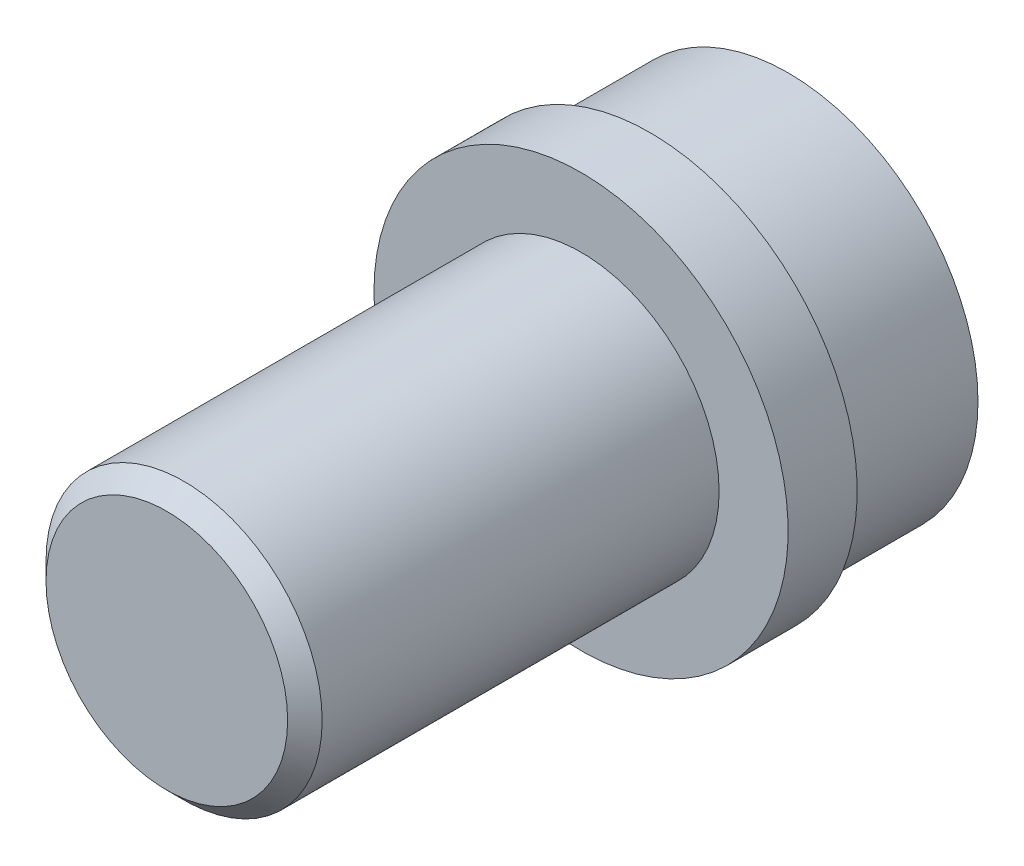
ISO-10303-21;
HEADER;
FILE_DESCRIPTION(('STEP AP214'),'2;1');
FILE_NAME('part.step','',(''),(''),'','','');
FILE_SCHEMA(('AUTOMOTIVE_DESIGN { 1 0 10303 214 1 1 1 1 }'));
ENDSEC;
DATA;
#1=APPLICATION_CONTEXT('core data for automotive mechanical design processes');
#2=APPLICATION_PROTOCOL_DEFINITION('international standard','automotive_design',2000,#1);
#3=PRODUCT_CONTEXT('',#1,'mechanical');
#4=PRODUCT('Part','Part','',(#3));
#5=PRODUCT_RELATED_PRODUCT_CATEGORY('part','',(#4));
#6=PRODUCT_DEFINITION_FORMATION('','',#4);
#7=PRODUCT_DEFINITION_CONTEXT('part definition',#1,'design');
#8=PRODUCT_DEFINITION('design','',#6,#7);
#9=PRODUCT_DEFINITION_SHAPE('','',#8);
#10=(LENGTH_UNIT() NAMED_UNIT(*) SI_UNIT(.MILLI.,.METRE.));
#11=(NAMED_UNIT(*) PLANE_ANGLE_UNIT() SI_UNIT($,.RADIAN.));
#12=(NAMED_UNIT(*) SI_UNIT($,.STERADIAN.) SOLID_ANGLE_UNIT());
#13=UNCERTAINTY_MEASURE_WITH_UNIT(LENGTH_MEASURE(1.E-05),#10,'distance_accuracy_value','');
#14=(GEOMETRIC_REPRESENTATION_CONTEXT(3) GLOBAL_UNCERTAINTY_ASSIGNED_CONTEXT((#13)) GLOBAL_UNIT_ASSIGNED_CONTEXT((#10,
#11,#12)) REPRESENTATION_CONTEXT('',''));
#15=CARTESIAN_POINT('',(0.,0.,0.));
#16=DIRECTION('',(0.,0.,1.));
#17=DIRECTION('',(1.,0.,0.));
#18=AXIS2_PLACEMENT_3D('',#15,#16,#17);
#19=CARTESIAN_POINT('',(0.,0.,12.));
#20=DIRECTION('',(0.,0.,-1.));
#21=DIRECTION('',(-1.,0.,0.));
#22=AXIS2_PLACEMENT_3D('',#19,#20,#21);
#23=CYLINDRICAL_SURFACE('',#22,4.);
#24=CARTESIAN_POINT('',(0.,0.,11.5));
#25=DIRECTION('',(0.,0.,1.));
#26=DIRECTION('',(1.,0.,0.));
#27=AXIS2_PLACEMENT_3D('',#24,#25,#26);
#28=CIRCLE('',#27,4.);
#29=CARTESIAN_POINT('',(4.,0.,11.5));
#30=VERTEX_POINT('',#29);
#31=EDGE_CURVE('E10',#30,#30,#28,.F.);
#32=ORIENTED_EDGE('',*,*,#31,.T.);
#33=EDGE_LOOP('',(#32));
#34=FACE_BOUND('',#33,.T.);
#35=CARTESIAN_POINT('',(0.,0.,0.));
#36=DIRECTION('',(0.,0.,-1.));
#37=DIRECTION('',(-1.,0.,0.));
#38=AXIS2_PLACEMENT_3D('',#35,#36,#37);
#39=CIRCLE('',#38,4.);
#40=CARTESIAN_POINT('',(-4.,0.,0.));
#41=VERTEX_POINT('',#40);
#42=EDGE_CURVE('E45',#41,#41,#39,.T.);
#43=ORIENTED_EDGE('',*,*,#42,.F.);
#44=EDGE_LOOP('',(#43));
#45=FACE_BOUND('',#44,.T.);
#46=ADVANCED_FACE('F34',(#34,#45),#23,.T.);
#47=CARTESIAN_POINT('',(0.,0.,12.));
#48=DIRECTION('',(0.,0.,1.));
#49=DIRECTION('',(1.,0.,0.));
#50=AXIS2_PLACEMENT_3D('',#47,#48,#49);
#51=PLANE('',#50);
#52=CARTESIAN_POINT('',(0.,0.,12.));
#53=DIRECTION('',(0.,0.,1.));
#54=DIRECTION('',(1.,0.,0.));
#55=AXIS2_PLACEMENT_3D('',#52,#53,#54);
#56=CIRCLE('',#55,3.5);
#57=CARTESIAN_POINT('',(3.5,0.,12.));
#58=VERTEX_POINT('',#57);
#59=EDGE_CURVE('E41',#58,#58,#56,.T.);
#60=ORIENTED_EDGE('',*,*,#59,.T.);
#61=EDGE_LOOP('',(#60));
#62=FACE_BOUND('',#61,.T.);
#63=ADVANCED_FACE('F85',(#62),#51,.T.);
#64=CARTESIAN_POINT('',(0.,0.,-2.));
#65=DIRECTION('',(0.,0.,1.));
#66=DIRECTION('',(1.,0.,0.));
#67=AXIS2_PLACEMENT_3D('',#64,#65,#66);
#68=CYLINDRICAL_SURFACE('',#67,6.);
#69=CARTESIAN_POINT('',(0.,0.,-2.));
#70=DIRECTION('',(0.,0.,-1.));
#71=DIRECTION('',(-1.,0.,0.));
#72=AXIS2_PLACEMENT_3D('',#69,#70,#71);
#73=CIRCLE('',#72,6.);
#74=CARTESIAN_POINT('',(-6.,0.,-2.));
#75=VERTEX_POINT('',#74);
#76=EDGE_CURVE('E49',#75,#75,#73,.T.);
#77=ORIENTED_EDGE('',*,*,#76,.F.);
#78=EDGE_LOOP('',(#77));
#79=FACE_BOUND('',#78,.T.);
#80=CARTESIAN_POINT('',(0.,0.,0.));
#81=DIRECTION('',(0.,0.,-1.));
#82=DIRECTION('',(-1.,0.,0.));
#83=AXIS2_PLACEMENT_3D('',#80,#81,#82);
#84=CIRCLE('',#83,6.);
#85=CARTESIAN_POINT('',(-6.,0.,0.));
#86=VERTEX_POINT('',#85);
#87=EDGE_CURVE('E56',#86,#86,#84,.T.);
#88=ORIENTED_EDGE('',*,*,#87,.T.);
#89=EDGE_LOOP('',(#88));
#90=FACE_BOUND('',#89,.T.);
#91=ADVANCED_FACE('F79',(#79,#90),#68,.T.);
#92=CARTESIAN_POINT('',(0.,0.,-2.));
#93=DIRECTION('',(0.,0.,-1.));
#94=DIRECTION('',(-1.,0.,0.));
#95=AXIS2_PLACEMENT_3D('',#92,#93,#94);
#96=PLANE('',#95);
#97=CARTESIAN_POINT('',(0.,0.,-2.));
#98=DIRECTION('',(0.,0.,-1.));
#99=DIRECTION('',(-1.,0.,0.));
#100=AXIS2_PLACEMENT_3D('',#97,#98,#99);
#101=CIRCLE('',#100,5.5);
#102=CARTESIAN_POINT('',(-5.5,0.,-2.));
#103=VERTEX_POINT('',#102);
#104=EDGE_CURVE('E54',#103,#103,#101,.T.);
#105=ORIENTED_EDGE('',*,*,#104,.F.);
#106=EDGE_LOOP('',(#105));
#107=FACE_BOUND('',#106,.T.);
#108=ORIENTED_EDGE('',*,*,#76,.T.);
#109=EDGE_LOOP('',(#108));
#110=FACE_BOUND('',#109,.T.);
#111=ADVANCED_FACE('F76',(#107,#110),#96,.T.);
#112=CARTESIAN_POINT('',(0.,0.,0.));
#113=DIRECTION('',(0.,0.,-1.));
#114=DIRECTION('',(-1.,0.,0.));
#115=AXIS2_PLACEMENT_3D('',#112,#113,#114);
#116=PLANE('',#115);
#117=ORIENTED_EDGE('',*,*,#42,.T.);
#118=EDGE_LOOP('',(#117));
#119=FACE_BOUND('',#118,.T.);
#120=ORIENTED_EDGE('',*,*,#87,.F.);
#121=EDGE_LOOP('',(#120));
#122=FACE_BOUND('',#121,.T.);
#123=ADVANCED_FACE('F72',(#119,#122),#116,.F.);
#124=CARTESIAN_POINT('',(0.,0.,-6.));
#125=DIRECTION('',(0.,0.,1.));
#126=DIRECTION('',(1.,0.,0.));
#127=AXIS2_PLACEMENT_3D('',#124,#125,#126);
#128=CYLINDRICAL_SURFACE('',#127,5.5);
#129=CARTESIAN_POINT('',(0.,0.,-6.));
#130=DIRECTION('',(0.,0.,-1.));
#131=DIRECTION('',(-1.,0.,0.));
#132=AXIS2_PLACEMENT_3D('',#129,#130,#131);
#133=CIRCLE('',#132,5.5);
#134=CARTESIAN_POINT('',(-5.5,0.,-6.));
#135=VERTEX_POINT('',#134);
#136=EDGE_CURVE('E59',#135,#135,#133,.T.);
#137=ORIENTED_EDGE('',*,*,#136,.F.);
#138=EDGE_LOOP('',(#137));
#139=FACE_BOUND('',#138,.T.);
#140=ORIENTED_EDGE('',*,*,#104,.T.);
#141=EDGE_LOOP('',(#140));
#142=FACE_BOUND('',#141,.T.);
#143=ADVANCED_FACE('F69',(#139,#142),#128,.T.);
#144=CARTESIAN_POINT('',(0.,0.,-6.));
#145=DIRECTION('',(0.,0.,-1.));
#146=DIRECTION('',(-1.,0.,0.));
#147=AXIS2_PLACEMENT_3D('',#144,#145,#146);
#148=PLANE('',#147);
#149=CARTESIAN_POINT('',(0.,0.,-6.));
#150=DIRECTION('',(0.,0.,-1.));
#151=DIRECTION('',(-1.,0.,0.));
#152=AXIS2_PLACEMENT_3D('',#149,#150,#151);
#153=CIRCLE('',#152,3.57211421989835);
#154=CARTESIAN_POINT('',(-3.57211421989835,0.,-6.));
#155=VERTEX_POINT('',#154);
#156=EDGE_CURVE('E52',#155,#155,#153,.F.);
#157=ORIENTED_EDGE('',*,*,#156,.T.);
#158=EDGE_LOOP('',(#157));
#159=FACE_BOUND('',#158,.T.);
#160=ORIENTED_EDGE('',*,*,#136,.T.);
#161=EDGE_LOOP('',(#160));
#162=FACE_BOUND('',#161,.T.);
#163=ADVANCED_FACE('F67',(#159,#162),#148,.T.);
#164=CARTESIAN_POINT('',(0.,0.,-4.2));
#165=DIRECTION('',(0.,0.,-1.));
#166=DIRECTION('',(1.,0.,0.));
#167=AXIS2_PLACEMENT_3D('',#164,#165,#166);
#168=SPHERICAL_SURFACE('',#167,4.);
#169=ORIENTED_EDGE('',*,*,#156,.F.);
#170=EDGE_LOOP('',(#169));
#171=FACE_BOUND('',#170,.T.);
#172=ADVANCED_FACE('F132',(#171),#168,.T.);
#173=CARTESIAN_POINT('',(0.,0.,12.));
#174=DIRECTION('',(0.,0.,-1.));
#175=DIRECTION('',(-1.,0.,0.));
#176=AXIS2_PLACEMENT_3D('',#173,#174,#175);
#177=CONICAL_SURFACE('',#176,3.5,0.785398163397448);
#178=ORIENTED_EDGE('',*,*,#31,.F.);
#179=EDGE_LOOP('',(#178));
#180=FACE_BOUND('',#179,.T.);
#181=ORIENTED_EDGE('',*,*,#59,.F.);
#182=EDGE_LOOP('',(#181));
#183=FACE_BOUND('',#182,.T.);
#184=ADVANCED_FACE('F36',(#180,#183),#177,.T.);
#185=CLOSED_SHELL('',(#46,#63,#91,#111,#123,#143,#163,#172,#184));
#186=MANIFOLD_SOLID_BREP('B2',#185);
#187=ADVANCED_BREP_SHAPE_REPRESENTATION('',(#18,#186),#14);
#188=SHAPE_DEFINITION_REPRESENTATION(#9,#187);
ENDSEC;
END-ISO-10303-21;
